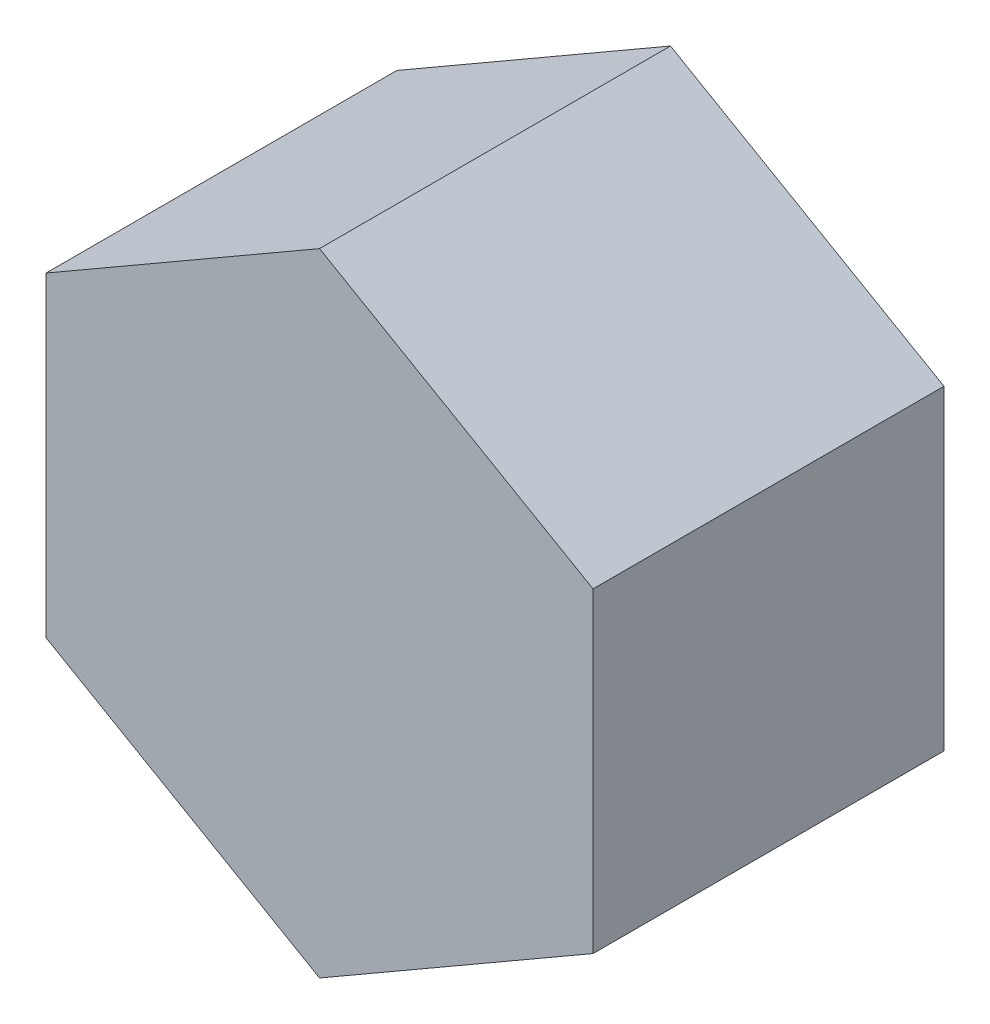
ISO-10303-21;
HEADER;
FILE_DESCRIPTION(('STEP AP214'),'2;1');
FILE_NAME('part.step','',(''),(''),'','','');
FILE_SCHEMA(('AUTOMOTIVE_DESIGN { 1 0 10303 214 1 1 1 1 }'));
ENDSEC;
DATA;
#1=APPLICATION_CONTEXT('core data for automotive mechanical design processes');
#2=APPLICATION_PROTOCOL_DEFINITION('international standard','automotive_design',2000,#1);
#3=PRODUCT_CONTEXT('',#1,'mechanical');
#4=PRODUCT('Part','Part','',(#3));
#5=PRODUCT_RELATED_PRODUCT_CATEGORY('part','',(#4));
#6=PRODUCT_DEFINITION_FORMATION('','',#4);
#7=PRODUCT_DEFINITION_CONTEXT('part definition',#1,'design');
#8=PRODUCT_DEFINITION('design','',#6,#7);
#9=PRODUCT_DEFINITION_SHAPE('','',#8);
#10=(LENGTH_UNIT() NAMED_UNIT(*) SI_UNIT(.MILLI.,.METRE.));
#11=(NAMED_UNIT(*) PLANE_ANGLE_UNIT() SI_UNIT($,.RADIAN.));
#12=(NAMED_UNIT(*) SI_UNIT($,.STERADIAN.) SOLID_ANGLE_UNIT());
#13=UNCERTAINTY_MEASURE_WITH_UNIT(LENGTH_MEASURE(1.E-05),#10,'distance_accuracy_value','');
#14=(GEOMETRIC_REPRESENTATION_CONTEXT(3) GLOBAL_UNCERTAINTY_ASSIGNED_CONTEXT((#13)) GLOBAL_UNIT_ASSIGNED_CONTEXT((#10,
#11,#12)) REPRESENTATION_CONTEXT('',''));
#15=CARTESIAN_POINT('',(0.,0.,0.));
#16=DIRECTION('',(0.,0.,1.));
#17=DIRECTION('',(1.,0.,0.));
#18=AXIS2_PLACEMENT_3D('',#15,#16,#17);
#19=CARTESIAN_POINT('',(0.,0.,1.));
#20=DIRECTION('',(0.,0.,1.));
#21=DIRECTION('',(1.,0.,0.));
#22=AXIS2_PLACEMENT_3D('',#19,#20,#21);
#23=PLANE('',#22);
#24=DIRECTION('',(-0.866025403784439,0.5,0.));
#25=VECTOR('',#24,1.);
#26=CARTESIAN_POINT('',(-1.71944815955413,-1.63433084030533,1.));
#27=LINE('',#26,#25);
#28=CARTESIAN_POINT('',(-1.71944815955413,-1.63433084030533,1.));
#29=VERTEX_POINT('',#28);
#30=CARTESIAN_POINT('',(-2.96944815955413,-0.912643003818294,1.));
#31=VERTEX_POINT('',#30);
#32=EDGE_CURVE('E143',#29,#31,#27,.T.);
#33=ORIENTED_EDGE('',*,*,#32,.T.);
#34=DIRECTION('',(-0.866025403784439,-0.5,0.));
#35=VECTOR('',#34,1.);
#36=CARTESIAN_POINT('',(-2.96944815955413,-0.912643003818294,1.));
#37=LINE('',#36,#35);
#38=CARTESIAN_POINT('',(-4.21944815955413,-1.63433084030533,1.));
#39=VERTEX_POINT('',#38);
#40=EDGE_CURVE('E137',#31,#39,#37,.T.);
#41=ORIENTED_EDGE('',*,*,#40,.T.);
#42=DIRECTION('',(0.,-1.,0.));
#43=VECTOR('',#42,1.);
#44=CARTESIAN_POINT('',(-4.21944815955413,-1.63433084030533,1.));
#45=LINE('',#44,#43);
#46=CARTESIAN_POINT('',(-4.21944815955413,-3.07770651327939,1.));
#47=VERTEX_POINT('',#46);
#48=EDGE_CURVE('E100',#39,#47,#45,.T.);
#49=ORIENTED_EDGE('',*,*,#48,.T.);
#50=DIRECTION('',(0.866025403784439,-0.5,0.));
#51=VECTOR('',#50,1.);
#52=CARTESIAN_POINT('',(-4.21944815955413,-3.07770651327939,1.));
#53=LINE('',#52,#51);
#54=CARTESIAN_POINT('',(-2.96944815955413,-3.79939434976642,1.));
#55=VERTEX_POINT('',#54);
#56=EDGE_CURVE('E114',#47,#55,#53,.T.);
#57=ORIENTED_EDGE('',*,*,#56,.T.);
#58=DIRECTION('',(0.866025403784438,0.5,0.));
#59=VECTOR('',#58,1.);
#60=CARTESIAN_POINT('',(-2.96944815955413,-3.79939434976642,1.));
#61=LINE('',#60,#59);
#62=CARTESIAN_POINT('',(-1.71944815955413,-3.07770651327939,1.));
#63=VERTEX_POINT('',#62);
#64=EDGE_CURVE('E124',#55,#63,#61,.T.);
#65=ORIENTED_EDGE('',*,*,#64,.T.);
#66=DIRECTION('',(0.,1.,0.));
#67=VECTOR('',#66,1.);
#68=CARTESIAN_POINT('',(-1.71944815955413,-3.07770651327939,1.));
#69=LINE('',#68,#67);
#70=EDGE_CURVE('E129',#63,#29,#69,.T.);
#71=ORIENTED_EDGE('',*,*,#70,.T.);
#72=EDGE_LOOP('',(#33,#41,#49,#57,#65,#71));
#73=FACE_BOUND('',#72,.T.);
#74=CARTESIAN_POINT('',(-2.96944815955413,-2.35601867679236,1.));
#75=DIRECTION('',(0.,0.,1.));
#76=DIRECTION('',(1.,0.,0.));
#77=AXIS2_PLACEMENT_3D('',#74,#75,#76);
#78=CIRCLE('',#77,2.775);
#79=CARTESIAN_POINT('',(-0.194448159554134,-2.35601867679236,1.));
#80=VERTEX_POINT('',#79);
#81=EDGE_CURVE('E11',#80,#80,#78,.T.);
#82=ORIENTED_EDGE('',*,*,#81,.F.);
#83=EDGE_LOOP('',(#82));
#84=FACE_BOUND('',#83,.T.);
#85=ADVANCED_FACE('F45',(#73,#84),#23,.F.);
#86=CARTESIAN_POINT('',(-2.96944815955413,-0.912643003818294,1.));
#87=DIRECTION('',(0.5,-0.866025403784439,0.));
#88=DIRECTION('',(0.866025403784439,0.5,0.));
#89=AXIS2_PLACEMENT_3D('',#86,#87,#88);
#90=PLANE('',#89);
#91=DIRECTION('',(-0.866025403784439,-0.5,0.));
#92=VECTOR('',#91,1.);
#93=CARTESIAN_POINT('',(-2.96944815955413,-0.912643003818294,0.));
#94=LINE('',#93,#92);
#95=CARTESIAN_POINT('',(-2.96944815955413,-0.912643003818294,0.));
#96=VERTEX_POINT('',#95);
#97=CARTESIAN_POINT('',(-4.21944815955413,-1.63433084030533,0.));
#98=VERTEX_POINT('',#97);
#99=EDGE_CURVE('E147',#96,#98,#94,.T.);
#100=ORIENTED_EDGE('',*,*,#99,.T.);
#101=DIRECTION('',(0.,0.,-1.));
#102=VECTOR('',#101,1.);
#103=CARTESIAN_POINT('',(-4.21944815955413,-1.63433084030533,1.));
#104=LINE('',#103,#102);
#105=EDGE_CURVE('E55',#39,#98,#104,.T.);
#106=ORIENTED_EDGE('',*,*,#105,.F.);
#107=ORIENTED_EDGE('',*,*,#40,.F.);
#108=DIRECTION('',(0.,0.,-1.));
#109=VECTOR('',#108,1.);
#110=CARTESIAN_POINT('',(-2.96944815955413,-0.912643003818294,1.));
#111=LINE('',#110,#109);
#112=EDGE_CURVE('E146',#31,#96,#111,.T.);
#113=ORIENTED_EDGE('',*,*,#112,.T.);
#114=EDGE_LOOP('',(#100,#106,#107,#113));
#115=FACE_BOUND('',#114,.T.);
#116=ADVANCED_FACE('F47',(#115),#90,.F.);
#117=CARTESIAN_POINT('',(-4.21944815955413,-1.63433084030533,1.));
#118=DIRECTION('',(1.,0.,0.));
#119=DIRECTION('',(0.,0.,-1.));
#120=AXIS2_PLACEMENT_3D('',#117,#118,#119);
#121=PLANE('',#120);
#122=DIRECTION('',(0.,-1.,0.));
#123=VECTOR('',#122,1.);
#124=CARTESIAN_POINT('',(-4.21944815955413,-1.63433084030533,0.));
#125=LINE('',#124,#123);
#126=CARTESIAN_POINT('',(-4.21944815955413,-3.07770651327939,0.));
#127=VERTEX_POINT('',#126);
#128=EDGE_CURVE('E151',#98,#127,#125,.T.);
#129=ORIENTED_EDGE('',*,*,#128,.T.);
#130=DIRECTION('',(0.,0.,-1.));
#131=VECTOR('',#130,1.);
#132=CARTESIAN_POINT('',(-4.21944815955413,-3.07770651327939,1.));
#133=LINE('',#132,#131);
#134=EDGE_CURVE('E120',#47,#127,#133,.T.);
#135=ORIENTED_EDGE('',*,*,#134,.F.);
#136=ORIENTED_EDGE('',*,*,#48,.F.);
#137=ORIENTED_EDGE('',*,*,#105,.T.);
#138=EDGE_LOOP('',(#129,#135,#136,#137));
#139=FACE_BOUND('',#138,.T.);
#140=ADVANCED_FACE('F172',(#139),#121,.F.);
#141=CARTESIAN_POINT('',(-4.21944815955413,-3.07770651327939,1.));
#142=DIRECTION('',(0.5,0.866025403784439,0.));
#143=DIRECTION('',(-0.866025403784439,0.5,0.));
#144=AXIS2_PLACEMENT_3D('',#141,#142,#143);
#145=PLANE('',#144);
#146=DIRECTION('',(0.866025403784439,-0.5,0.));
#147=VECTOR('',#146,1.);
#148=CARTESIAN_POINT('',(-4.21944815955413,-3.07770651327939,0.));
#149=LINE('',#148,#147);
#150=CARTESIAN_POINT('',(-2.96944815955413,-3.79939434976642,0.));
#151=VERTEX_POINT('',#150);
#152=EDGE_CURVE('E116',#127,#151,#149,.T.);
#153=ORIENTED_EDGE('',*,*,#152,.T.);
#154=DIRECTION('',(0.,0.,-1.));
#155=VECTOR('',#154,1.);
#156=CARTESIAN_POINT('',(-2.96944815955413,-3.79939434976642,1.));
#157=LINE('',#156,#155);
#158=EDGE_CURVE('E109',#55,#151,#157,.T.);
#159=ORIENTED_EDGE('',*,*,#158,.F.);
#160=ORIENTED_EDGE('',*,*,#56,.F.);
#161=ORIENTED_EDGE('',*,*,#134,.T.);
#162=EDGE_LOOP('',(#153,#159,#160,#161));
#163=FACE_BOUND('',#162,.T.);
#164=ADVANCED_FACE('F111',(#163),#145,.F.);
#165=CARTESIAN_POINT('',(-2.96944815955413,-3.79939434976642,1.));
#166=DIRECTION('',(-0.5,0.866025403784439,0.));
#167=DIRECTION('',(-0.866025403784438,-0.5,0.));
#168=AXIS2_PLACEMENT_3D('',#165,#166,#167);
#169=PLANE('',#168);
#170=DIRECTION('',(0.866025403784438,0.5,0.));
#171=VECTOR('',#170,1.);
#172=CARTESIAN_POINT('',(-2.96944815955413,-3.79939434976642,0.));
#173=LINE('',#172,#171);
#174=CARTESIAN_POINT('',(-1.71944815955413,-3.07770651327939,0.));
#175=VERTEX_POINT('',#174);
#176=EDGE_CURVE('E157',#151,#175,#173,.T.);
#177=ORIENTED_EDGE('',*,*,#176,.T.);
#178=DIRECTION('',(0.,0.,-1.));
#179=VECTOR('',#178,1.);
#180=CARTESIAN_POINT('',(-1.71944815955413,-3.07770651327939,1.));
#181=LINE('',#180,#179);
#182=EDGE_CURVE('E121',#63,#175,#181,.T.);
#183=ORIENTED_EDGE('',*,*,#182,.F.);
#184=ORIENTED_EDGE('',*,*,#64,.F.);
#185=ORIENTED_EDGE('',*,*,#158,.T.);
#186=EDGE_LOOP('',(#177,#183,#184,#185));
#187=FACE_BOUND('',#186,.T.);
#188=ADVANCED_FACE('F125',(#187),#169,.F.);
#189=CARTESIAN_POINT('',(-1.71944815955413,-3.07770651327939,1.));
#190=DIRECTION('',(-1.,0.,0.));
#191=DIRECTION('',(0.,0.,1.));
#192=AXIS2_PLACEMENT_3D('',#189,#190,#191);
#193=PLANE('',#192);
#194=DIRECTION('',(0.,1.,0.));
#195=VECTOR('',#194,1.);
#196=CARTESIAN_POINT('',(-1.71944815955413,-3.07770651327939,0.));
#197=LINE('',#196,#195);
#198=CARTESIAN_POINT('',(-1.71944815955413,-1.63433084030533,0.));
#199=VERTEX_POINT('',#198);
#200=EDGE_CURVE('E85',#175,#199,#197,.T.);
#201=ORIENTED_EDGE('',*,*,#200,.T.);
#202=DIRECTION('',(0.,0.,-1.));
#203=VECTOR('',#202,1.);
#204=CARTESIAN_POINT('',(-1.71944815955413,-1.63433084030533,1.));
#205=LINE('',#204,#203);
#206=EDGE_CURVE('E63',#29,#199,#205,.T.);
#207=ORIENTED_EDGE('',*,*,#206,.F.);
#208=ORIENTED_EDGE('',*,*,#70,.F.);
#209=ORIENTED_EDGE('',*,*,#182,.T.);
#210=EDGE_LOOP('',(#201,#207,#208,#209));
#211=FACE_BOUND('',#210,.T.);
#212=ADVANCED_FACE('F178',(#211),#193,.F.);
#213=CARTESIAN_POINT('',(-1.71944815955413,-1.63433084030533,1.));
#214=DIRECTION('',(-0.5,-0.866025403784439,0.));
#215=DIRECTION('',(0.866025403784439,-0.5,0.));
#216=AXIS2_PLACEMENT_3D('',#213,#214,#215);
#217=PLANE('',#216);
#218=DIRECTION('',(-0.866025403784439,0.5,0.));
#219=VECTOR('',#218,1.);
#220=CARTESIAN_POINT('',(-1.71944815955413,-1.63433084030533,0.));
#221=LINE('',#220,#219);
#222=EDGE_CURVE('E91',#199,#96,#221,.T.);
#223=ORIENTED_EDGE('',*,*,#222,.T.);
#224=ORIENTED_EDGE('',*,*,#112,.F.);
#225=ORIENTED_EDGE('',*,*,#32,.F.);
#226=ORIENTED_EDGE('',*,*,#206,.T.);
#227=EDGE_LOOP('',(#223,#224,#225,#226));
#228=FACE_BOUND('',#227,.T.);
#229=ADVANCED_FACE('F180',(#228),#217,.F.);
#230=CARTESIAN_POINT('',(0.,0.,0.));
#231=DIRECTION('',(0.,0.,1.));
#232=DIRECTION('',(1.,0.,0.));
#233=AXIS2_PLACEMENT_3D('',#230,#231,#232);
#234=PLANE('',#233);
#235=ORIENTED_EDGE('',*,*,#99,.F.);
#236=ORIENTED_EDGE('',*,*,#222,.F.);
#237=ORIENTED_EDGE('',*,*,#200,.F.);
#238=ORIENTED_EDGE('',*,*,#176,.F.);
#239=ORIENTED_EDGE('',*,*,#152,.F.);
#240=ORIENTED_EDGE('',*,*,#128,.F.);
#241=EDGE_LOOP('',(#235,#236,#237,#238,#239,#240));
#242=FACE_BOUND('',#241,.T.);
#243=ADVANCED_FACE('F177',(#242),#234,.F.);
#244=CARTESIAN_POINT('',(0.,0.,-2.));
#245=DIRECTION('',(0.,0.,1.));
#246=DIRECTION('',(1.,0.,0.));
#247=AXIS2_PLACEMENT_3D('',#244,#245,#246);
#248=PLANE('',#247);
#249=CARTESIAN_POINT('',(-2.96944815955413,-2.35601867679236,-2.));
#250=DIRECTION('',(0.,0.,1.));
#251=DIRECTION('',(1.,0.,0.));
#252=AXIS2_PLACEMENT_3D('',#249,#250,#251);
#253=CIRCLE('',#252,2.775);
#254=CARTESIAN_POINT('',(-0.194448159554134,-2.35601867679236,-2.));
#255=VERTEX_POINT('',#254);
#256=EDGE_CURVE('E255',#255,#255,#253,.T.);
#257=ORIENTED_EDGE('',*,*,#256,.T.);
#258=EDGE_LOOP('',(#257));
#259=FACE_BOUND('',#258,.T.);
#260=DIRECTION('',(0.866025403784442,-0.499999999999995,0.));
#261=VECTOR('',#260,1.);
#262=CARTESIAN_POINT('',(-6.86656247658408,-4.6060186767924,-2.));
#263=LINE('',#262,#261);
#264=CARTESIAN_POINT('',(-6.86656247658408,-4.6060186767924,-2.));
#265=VERTEX_POINT('',#264);
#266=CARTESIAN_POINT('',(-2.96944815955413,-6.85601867679236,-2.));
#267=VERTEX_POINT('',#266);
#268=EDGE_CURVE('E234',#265,#267,#263,.T.);
#269=ORIENTED_EDGE('',*,*,#268,.F.);
#270=DIRECTION('',(0.,-1.,0.));
#271=VECTOR('',#270,1.);
#272=CARTESIAN_POINT('',(-6.86656247658413,-0.106018676792396,-2.));
#273=LINE('',#272,#271);
#274=CARTESIAN_POINT('',(-6.86656247658413,-0.106018676792396,-2.));
#275=VERTEX_POINT('',#274);
#276=EDGE_CURVE('E250',#275,#265,#273,.T.);
#277=ORIENTED_EDGE('',*,*,#276,.F.);
#278=DIRECTION('',(-0.866025403784434,-0.500000000000007,0.));
#279=VECTOR('',#278,1.);
#280=CARTESIAN_POINT('',(-2.96944815955416,2.14398132320764,-2.));
#281=LINE('',#280,#279);
#282=CARTESIAN_POINT('',(-2.96944815955416,2.14398132320764,-2.));
#283=VERTEX_POINT('',#282);
#284=EDGE_CURVE('E261',#283,#275,#281,.T.);
#285=ORIENTED_EDGE('',*,*,#284,.F.);
#286=DIRECTION('',(-0.866025403784442,0.499999999999995,0.));
#287=VECTOR('',#286,1.);
#288=CARTESIAN_POINT('',(0.92766615747583,-0.106018676792342,-2.));
#289=LINE('',#288,#287);
#290=CARTESIAN_POINT('',(0.92766615747583,-0.106018676792342,-2.));
#291=VERTEX_POINT('',#290);
#292=EDGE_CURVE('E267',#291,#283,#289,.T.);
#293=ORIENTED_EDGE('',*,*,#292,.F.);
#294=DIRECTION('',(0.,1.,0.));
#295=VECTOR('',#294,1.);
#296=CARTESIAN_POINT('',(0.927666157475845,-4.60601867679235,-2.));
#297=LINE('',#296,#295);
#298=CARTESIAN_POINT('',(0.927666157475845,-4.60601867679235,-2.));
#299=VERTEX_POINT('',#298);
#300=EDGE_CURVE('E332',#299,#291,#297,.T.);
#301=ORIENTED_EDGE('',*,*,#300,.F.);
#302=DIRECTION('',(0.866025403784438,0.500000000000001,0.));
#303=VECTOR('',#302,1.);
#304=CARTESIAN_POINT('',(-2.96944815955413,-6.85601867679236,-2.));
#305=LINE('',#304,#303);
#306=EDGE_CURVE('E253',#267,#299,#305,.T.);
#307=ORIENTED_EDGE('',*,*,#306,.F.);
#308=EDGE_LOOP('',(#269,#277,#285,#293,#301,#307));
#309=FACE_BOUND('',#308,.T.);
#310=ADVANCED_FACE('F188',(#259,#309),#248,.F.);
#311=CARTESIAN_POINT('',(-2.96944815955413,-2.35601867679236,-2.));
#312=DIRECTION('',(0.,0.,1.));
#313=DIRECTION('',(1.,0.,0.));
#314=AXIS2_PLACEMENT_3D('',#311,#312,#313);
#315=CYLINDRICAL_SURFACE('',#314,2.775);
#316=ORIENTED_EDGE('',*,*,#256,.F.);
#317=EDGE_LOOP('',(#316));
#318=FACE_BOUND('',#317,.T.);
#319=ORIENTED_EDGE('',*,*,#81,.T.);
#320=EDGE_LOOP('',(#319));
#321=FACE_BOUND('',#320,.T.);
#322=ADVANCED_FACE('F343',(#318,#321),#315,.F.);
#323=CARTESIAN_POINT('',(0.,0.,3.));
#324=DIRECTION('',(0.,0.,1.));
#325=DIRECTION('',(1.,0.,0.));
#326=AXIS2_PLACEMENT_3D('',#323,#324,#325);
#327=PLANE('',#326);
#328=DIRECTION('',(0.866025403784442,-0.499999999999995,0.));
#329=VECTOR('',#328,1.);
#330=CARTESIAN_POINT('',(-6.86656247658408,-4.6060186767924,3.));
#331=LINE('',#330,#329);
#332=CARTESIAN_POINT('',(-6.86656247658408,-4.6060186767924,3.));
#333=VERTEX_POINT('',#332);
#334=CARTESIAN_POINT('',(-2.96944815955413,-6.85601867679236,3.));
#335=VERTEX_POINT('',#334);
#336=EDGE_CURVE('E236',#333,#335,#331,.T.);
#337=ORIENTED_EDGE('',*,*,#336,.T.);
#338=DIRECTION('',(0.866025403784438,0.500000000000001,0.));
#339=VECTOR('',#338,1.);
#340=CARTESIAN_POINT('',(-2.96944815955413,-6.85601867679236,3.));
#341=LINE('',#340,#339);
#342=CARTESIAN_POINT('',(0.927666157475845,-4.60601867679235,3.));
#343=VERTEX_POINT('',#342);
#344=EDGE_CURVE('E265',#335,#343,#341,.T.);
#345=ORIENTED_EDGE('',*,*,#344,.T.);
#346=DIRECTION('',(0.,1.,0.));
#347=VECTOR('',#346,1.);
#348=CARTESIAN_POINT('',(0.927666157475845,-4.60601867679235,3.));
#349=LINE('',#348,#347);
#350=CARTESIAN_POINT('',(0.92766615747583,-0.106018676792342,3.));
#351=VERTEX_POINT('',#350);
#352=EDGE_CURVE('E274',#343,#351,#349,.T.);
#353=ORIENTED_EDGE('',*,*,#352,.T.);
#354=DIRECTION('',(-0.866025403784442,0.499999999999995,0.));
#355=VECTOR('',#354,1.);
#356=CARTESIAN_POINT('',(0.92766615747583,-0.106018676792342,3.));
#357=LINE('',#356,#355);
#358=CARTESIAN_POINT('',(-2.96944815955416,2.14398132320764,3.));
#359=VERTEX_POINT('',#358);
#360=EDGE_CURVE('E278',#351,#359,#357,.T.);
#361=ORIENTED_EDGE('',*,*,#360,.T.);
#362=DIRECTION('',(-0.866025403784434,-0.500000000000007,0.));
#363=VECTOR('',#362,1.);
#364=CARTESIAN_POINT('',(-2.96944815955416,2.14398132320764,3.));
#365=LINE('',#364,#363);
#366=CARTESIAN_POINT('',(-6.86656247658413,-0.106018676792396,3.));
#367=VERTEX_POINT('',#366);
#368=EDGE_CURVE('E282',#359,#367,#365,.T.);
#369=ORIENTED_EDGE('',*,*,#368,.T.);
#370=DIRECTION('',(0.,-1.,0.));
#371=VECTOR('',#370,1.);
#372=CARTESIAN_POINT('',(-6.86656247658413,-0.106018676792396,3.));
#373=LINE('',#372,#371);
#374=EDGE_CURVE('E244',#367,#333,#373,.T.);
#375=ORIENTED_EDGE('',*,*,#374,.T.);
#376=EDGE_LOOP('',(#337,#345,#353,#361,#369,#375));
#377=FACE_BOUND('',#376,.T.);
#378=ADVANCED_FACE('F198',(#377),#327,.T.);
#379=CARTESIAN_POINT('',(-6.86656247658413,-0.106018676792396,3.));
#380=DIRECTION('',(1.,0.,0.));
#381=DIRECTION('',(0.,1.,0.));
#382=AXIS2_PLACEMENT_3D('',#379,#380,#381);
#383=PLANE('',#382);
#384=DIRECTION('',(0.,0.,-1.));
#385=VECTOR('',#384,1.);
#386=CARTESIAN_POINT('',(-6.86656247658413,-0.106018676792396,3.));
#387=LINE('',#386,#385);
#388=EDGE_CURVE('E243',#367,#275,#387,.T.);
#389=ORIENTED_EDGE('',*,*,#388,.T.);
#390=ORIENTED_EDGE('',*,*,#276,.T.);
#391=DIRECTION('',(0.,0.,-1.));
#392=VECTOR('',#391,1.);
#393=CARTESIAN_POINT('',(-6.86656247658408,-4.6060186767924,3.));
#394=LINE('',#393,#392);
#395=EDGE_CURVE('E230',#333,#265,#394,.T.);
#396=ORIENTED_EDGE('',*,*,#395,.F.);
#397=ORIENTED_EDGE('',*,*,#374,.F.);
#398=EDGE_LOOP('',(#389,#390,#396,#397));
#399=FACE_BOUND('',#398,.T.);
#400=ADVANCED_FACE('F200',(#399),#383,.F.);
#401=CARTESIAN_POINT('',(-2.96944815955416,2.14398132320764,3.));
#402=DIRECTION('',(0.500000000000007,-0.866025403784435,0.));
#403=DIRECTION('',(0.866025403784435,0.500000000000007,0.));
#404=AXIS2_PLACEMENT_3D('',#401,#402,#403);
#405=PLANE('',#404);
#406=DIRECTION('',(0.,0.,-1.));
#407=VECTOR('',#406,1.);
#408=CARTESIAN_POINT('',(-2.96944815955416,2.14398132320764,3.));
#409=LINE('',#408,#407);
#410=EDGE_CURVE('E291',#359,#283,#409,.T.);
#411=ORIENTED_EDGE('',*,*,#410,.T.);
#412=ORIENTED_EDGE('',*,*,#284,.T.);
#413=ORIENTED_EDGE('',*,*,#388,.F.);
#414=ORIENTED_EDGE('',*,*,#368,.F.);
#415=EDGE_LOOP('',(#411,#412,#413,#414));
#416=FACE_BOUND('',#415,.T.);
#417=ADVANCED_FACE('F203',(#416),#405,.F.);
#418=CARTESIAN_POINT('',(0.92766615747583,-0.106018676792342,3.));
#419=DIRECTION('',(-0.499999999999995,-0.866025403784442,0.));
#420=DIRECTION('',(0.866025403784442,-0.499999999999995,0.));
#421=AXIS2_PLACEMENT_3D('',#418,#419,#420);
#422=PLANE('',#421);
#423=DIRECTION('',(0.,0.,-1.));
#424=VECTOR('',#423,1.);
#425=CARTESIAN_POINT('',(0.92766615747583,-0.106018676792342,3.));
#426=LINE('',#425,#424);
#427=EDGE_CURVE('E295',#351,#291,#426,.T.);
#428=ORIENTED_EDGE('',*,*,#427,.T.);
#429=ORIENTED_EDGE('',*,*,#292,.T.);
#430=ORIENTED_EDGE('',*,*,#410,.F.);
#431=ORIENTED_EDGE('',*,*,#360,.F.);
#432=EDGE_LOOP('',(#428,#429,#430,#431));
#433=FACE_BOUND('',#432,.T.);
#434=ADVANCED_FACE('F207',(#433),#422,.F.);
#435=CARTESIAN_POINT('',(0.927666157475845,-4.60601867679235,3.));
#436=DIRECTION('',(-1.,0.,0.));
#437=DIRECTION('',(0.,-1.,0.));
#438=AXIS2_PLACEMENT_3D('',#435,#436,#437);
#439=PLANE('',#438);
#440=DIRECTION('',(0.,0.,-1.));
#441=VECTOR('',#440,1.);
#442=CARTESIAN_POINT('',(0.927666157475845,-4.60601867679235,3.));
#443=LINE('',#442,#441);
#444=EDGE_CURVE('E299',#343,#299,#443,.T.);
#445=ORIENTED_EDGE('',*,*,#444,.T.);
#446=ORIENTED_EDGE('',*,*,#300,.T.);
#447=ORIENTED_EDGE('',*,*,#427,.F.);
#448=ORIENTED_EDGE('',*,*,#352,.F.);
#449=EDGE_LOOP('',(#445,#446,#447,#448));
#450=FACE_BOUND('',#449,.T.);
#451=ADVANCED_FACE('F211',(#450),#439,.F.);
#452=CARTESIAN_POINT('',(-2.96944815955413,-6.85601867679236,3.));
#453=DIRECTION('',(-0.500000000000001,0.866025403784438,0.));
#454=DIRECTION('',(-0.866025403784438,-0.500000000000001,0.));
#455=AXIS2_PLACEMENT_3D('',#452,#453,#454);
#456=PLANE('',#455);
#457=DIRECTION('',(0.,0.,-1.));
#458=VECTOR('',#457,1.);
#459=CARTESIAN_POINT('',(-2.96944815955413,-6.85601867679236,3.));
#460=LINE('',#459,#458);
#461=EDGE_CURVE('E152',#335,#267,#460,.T.);
#462=ORIENTED_EDGE('',*,*,#461,.T.);
#463=ORIENTED_EDGE('',*,*,#306,.T.);
#464=ORIENTED_EDGE('',*,*,#444,.F.);
#465=ORIENTED_EDGE('',*,*,#344,.F.);
#466=EDGE_LOOP('',(#462,#463,#464,#465));
#467=FACE_BOUND('',#466,.T.);
#468=ADVANCED_FACE('F215',(#467),#456,.F.);
#469=CARTESIAN_POINT('',(-6.86656247658408,-4.6060186767924,3.));
#470=DIRECTION('',(0.499999999999995,0.866025403784442,0.));
#471=DIRECTION('',(-0.866025403784442,0.499999999999995,0.));
#472=AXIS2_PLACEMENT_3D('',#469,#470,#471);
#473=PLANE('',#472);
#474=ORIENTED_EDGE('',*,*,#395,.T.);
#475=ORIENTED_EDGE('',*,*,#268,.T.);
#476=ORIENTED_EDGE('',*,*,#461,.F.);
#477=ORIENTED_EDGE('',*,*,#336,.F.);
#478=EDGE_LOOP('',(#474,#475,#476,#477));
#479=FACE_BOUND('',#478,.T.);
#480=ADVANCED_FACE('F219',(#479),#473,.F.);
#481=CLOSED_SHELL('',(#85,#116,#140,#164,#188,#212,#229,#243,#310,#322,#378,#400,#417,#434,#451,
#468,#480));
#482=MANIFOLD_SOLID_BREP('B2',#481);
#483=ADVANCED_BREP_SHAPE_REPRESENTATION('',(#18,#482),#14);
#484=SHAPE_DEFINITION_REPRESENTATION(#9,#483);
ENDSEC;
END-ISO-10303-21;
